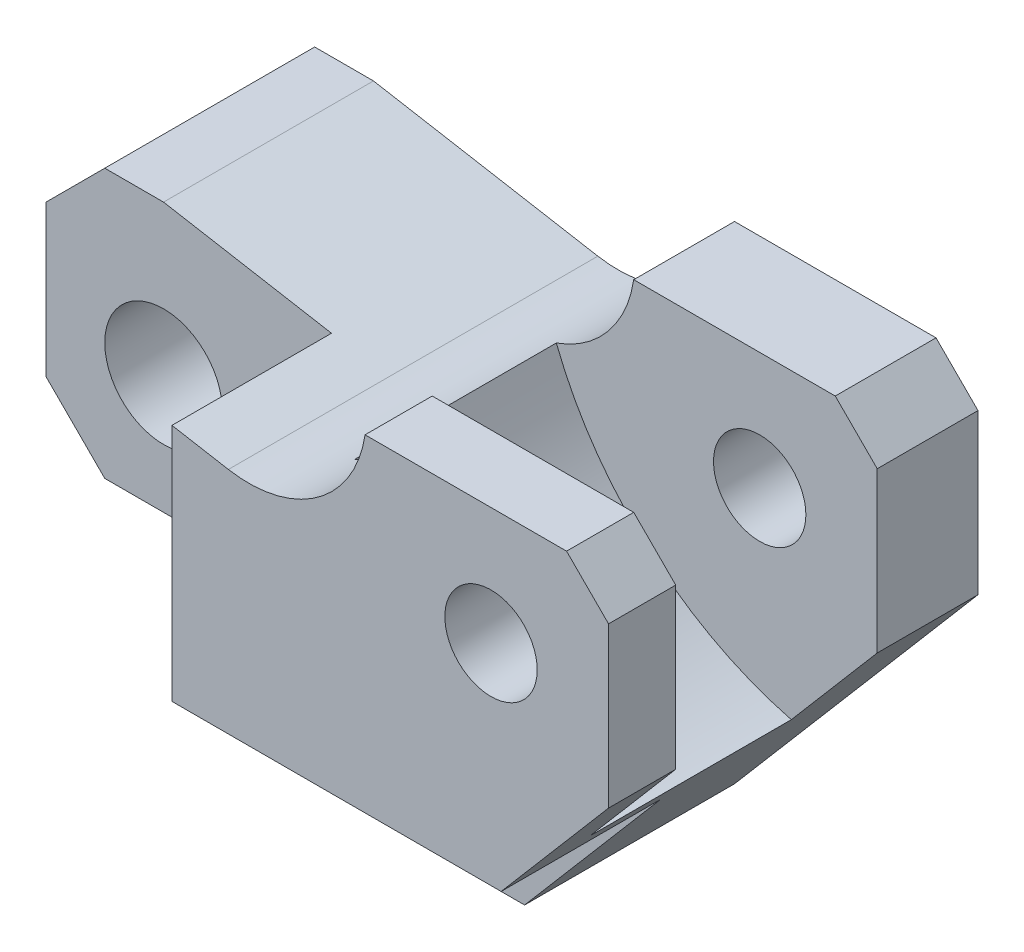
ISO-10303-21;
HEADER;
FILE_DESCRIPTION(('STEP AP214'),'2;1');
FILE_NAME('part.step','',(''),(''),'','','');
FILE_SCHEMA(('AUTOMOTIVE_DESIGN { 1 0 10303 214 1 1 1 1 }'));
ENDSEC;
DATA;
#1=APPLICATION_CONTEXT('core data for automotive mechanical design processes');
#2=APPLICATION_PROTOCOL_DEFINITION('international standard','automotive_design',2000,#1);
#3=PRODUCT_CONTEXT('',#1,'mechanical');
#4=PRODUCT('Part','Part','',(#3));
#5=PRODUCT_RELATED_PRODUCT_CATEGORY('part','',(#4));
#6=PRODUCT_DEFINITION_FORMATION('','',#4);
#7=PRODUCT_DEFINITION_CONTEXT('part definition',#1,'design');
#8=PRODUCT_DEFINITION('design','',#6,#7);
#9=PRODUCT_DEFINITION_SHAPE('','',#8);
#10=(LENGTH_UNIT() NAMED_UNIT(*) SI_UNIT(.MILLI.,.METRE.));
#11=(NAMED_UNIT(*) PLANE_ANGLE_UNIT() SI_UNIT($,.RADIAN.));
#12=(NAMED_UNIT(*) SI_UNIT($,.STERADIAN.) SOLID_ANGLE_UNIT());
#13=UNCERTAINTY_MEASURE_WITH_UNIT(LENGTH_MEASURE(1.E-05),#10,'distance_accuracy_value','');
#14=(GEOMETRIC_REPRESENTATION_CONTEXT(3) GLOBAL_UNCERTAINTY_ASSIGNED_CONTEXT((#13)) GLOBAL_UNIT_ASSIGNED_CONTEXT((#10,
#11,#12)) REPRESENTATION_CONTEXT('',''));
#15=CARTESIAN_POINT('',(0.,0.,0.));
#16=DIRECTION('',(0.,0.,1.));
#17=DIRECTION('',(1.,0.,0.));
#18=AXIS2_PLACEMENT_3D('',#15,#16,#17);
#19=CARTESIAN_POINT('',(-3.11505664168053,2.65696007672751,44.));
#20=DIRECTION('',(0.760833951959086,-0.64894660608275,0.));
#21=DIRECTION('',(0.64894660608275,0.760833951959086,0.));
#22=AXIS2_PLACEMENT_3D('',#19,#20,#21);
#23=PLANE('',#22);
#24=DIRECTION('',(0.,0.,-1.));
#25=VECTOR('',#24,1.);
#26=CARTESIAN_POINT('',(-4.21574320437276,1.36649996874352,36.));
#27=LINE('',#26,#25);
#28=CARTESIAN_POINT('',(-4.21574320437276,1.36649996874352,36.));
#29=VERTEX_POINT('',#28);
#30=CARTESIAN_POINT('',(-4.21574320437276,1.36649996874352,12.));
#31=VERTEX_POINT('',#30);
#32=EDGE_CURVE('E218',#29,#31,#27,.T.);
#33=ORIENTED_EDGE('',*,*,#32,.F.);
#34=DIRECTION('',(-0.64894660608275,-0.760833951959086,0.));
#35=VECTOR('',#34,1.);
#36=CARTESIAN_POINT('',(6.01955091327429,13.3664999687435,36.));
#37=LINE('',#36,#35);
#38=CARTESIAN_POINT('',(6.01955091327429,13.3664999687435,36.));
#39=VERTEX_POINT('',#38);
#40=EDGE_CURVE('E203',#39,#29,#37,.T.);
#41=ORIENTED_EDGE('',*,*,#40,.F.);
#42=DIRECTION('',(0.,0.,-1.));
#43=VECTOR('',#42,1.);
#44=CARTESIAN_POINT('',(6.01955091327429,13.3664999687435,44.));
#45=LINE('',#44,#43);
#46=CARTESIAN_POINT('',(6.01955091327429,13.3664999687435,44.));
#47=VERTEX_POINT('',#46);
#48=EDGE_CURVE('E215',#47,#39,#45,.T.);
#49=ORIENTED_EDGE('',*,*,#48,.F.);
#50=DIRECTION('',(-0.64894660608275,-0.760833951959086,0.));
#51=VECTOR('',#50,1.);
#52=CARTESIAN_POINT('',(-3.11505664168053,2.65696007672751,44.));
#53=LINE('',#52,#51);
#54=CARTESIAN_POINT('',(-6.77456673378454,-1.63350003125649,44.));
#55=VERTEX_POINT('',#54);
#56=EDGE_CURVE('E320',#47,#55,#53,.T.);
#57=ORIENTED_EDGE('',*,*,#56,.T.);
#58=DIRECTION('',(0.,0.,1.));
#59=VECTOR('',#58,1.);
#60=CARTESIAN_POINT('',(-6.77456673378454,-1.63350003125649,25.));
#61=LINE('',#60,#59);
#62=CARTESIAN_POINT('',(-6.77456673378454,-1.63350003125649,25.));
#63=VERTEX_POINT('',#62);
#64=EDGE_CURVE('E273',#63,#55,#61,.T.);
#65=ORIENTED_EDGE('',*,*,#64,.F.);
#66=DIRECTION('',(0.648946606082749,0.760833951959086,0.));
#67=VECTOR('',#66,1.);
#68=CARTESIAN_POINT('',(-6.77456673378454,-1.63350003125649,25.));
#69=LINE('',#68,#67);
#70=CARTESIAN_POINT('',(-22.9804490867257,-20.6335000312565,25.));
#71=VERTEX_POINT('',#70);
#72=EDGE_CURVE('E267',#71,#63,#69,.T.);
#73=ORIENTED_EDGE('',*,*,#72,.F.);
#74=DIRECTION('',(0.,0.,-1.));
#75=VECTOR('',#74,1.);
#76=CARTESIAN_POINT('',(-22.9804490867257,-20.6335000312565,44.));
#77=LINE('',#76,#75);
#78=CARTESIAN_POINT('',(-22.9804490867257,-20.6335000312565,0.));
#79=VERTEX_POINT('',#78);
#80=EDGE_CURVE('E227',#71,#79,#77,.T.);
#81=ORIENTED_EDGE('',*,*,#80,.T.);
#82=DIRECTION('',(-0.64894660608275,-0.760833951959086,0.));
#83=VECTOR('',#82,1.);
#84=CARTESIAN_POINT('',(-3.11505664168053,2.65696007672751,0.));
#85=LINE('',#84,#83);
#86=CARTESIAN_POINT('',(6.01955091327429,13.3664999687435,0.));
#87=VERTEX_POINT('',#86);
#88=EDGE_CURVE('E360',#87,#79,#85,.T.);
#89=ORIENTED_EDGE('',*,*,#88,.F.);
#90=CARTESIAN_POINT('',(6.01955091327429,13.3664999687435,12.));
#91=VERTEX_POINT('',#90);
#92=EDGE_CURVE('E228',#91,#87,#45,.T.);
#93=ORIENTED_EDGE('',*,*,#92,.F.);
#94=DIRECTION('',(-0.64894660608275,-0.760833951959086,0.));
#95=VECTOR('',#94,1.);
#96=CARTESIAN_POINT('',(6.01955091327429,13.3664999687435,12.));
#97=LINE('',#96,#95);
#98=EDGE_CURVE('E464',#91,#31,#97,.T.);
#99=ORIENTED_EDGE('',*,*,#98,.T.);
#100=EDGE_LOOP('',(#33,#41,#49,#57,#65,#73,#81,#89,#93,#99));
#101=FACE_BOUND('',#100,.T.);
#102=ADVANCED_FACE('F41',(#101),#23,.T.);
#103=CARTESIAN_POINT('',(6.01955091327429,0.,44.));
#104=DIRECTION('',(1.,0.,0.));
#105=DIRECTION('',(0.,1.,0.));
#106=AXIS2_PLACEMENT_3D('',#103,#104,#105);
#107=PLANE('',#106);
#108=ORIENTED_EDGE('',*,*,#48,.T.);
#109=DIRECTION('',(0.,-1.,0.));
#110=VECTOR('',#109,1.);
#111=CARTESIAN_POINT('',(6.01955091327428,32.3664999687435,36.));
#112=LINE('',#111,#110);
#113=CARTESIAN_POINT('',(6.01955091327428,32.3664999687435,36.));
#114=VERTEX_POINT('',#113);
#115=EDGE_CURVE('E198',#114,#39,#112,.T.);
#116=ORIENTED_EDGE('',*,*,#115,.F.);
#117=DIRECTION('',(0.,0.,-1.));
#118=VECTOR('',#117,1.);
#119=CARTESIAN_POINT('',(6.01955091327428,32.3664999687435,44.));
#120=LINE('',#119,#118);
#121=CARTESIAN_POINT('',(6.01955091327428,32.3664999687435,44.));
#122=VERTEX_POINT('',#121);
#123=EDGE_CURVE('E233',#122,#114,#120,.T.);
#124=ORIENTED_EDGE('',*,*,#123,.F.);
#125=DIRECTION('',(0.,-1.,0.));
#126=VECTOR('',#125,1.);
#127=CARTESIAN_POINT('',(6.01955091327429,0.,44.));
#128=LINE('',#127,#126);
#129=EDGE_CURVE('E225',#122,#47,#128,.T.);
#130=ORIENTED_EDGE('',*,*,#129,.T.);
#131=EDGE_LOOP('',(#108,#116,#124,#130));
#132=FACE_BOUND('',#131,.T.);
#133=ADVANCED_FACE('F223',(#132),#107,.T.);
#134=CARTESIAN_POINT('',(19.1930254410089,19.1930254410089,44.));
#135=DIRECTION('',(0.707106781186548,0.707106781186548,0.));
#136=DIRECTION('',(-0.707106781186548,0.707106781186548,0.));
#137=AXIS2_PLACEMENT_3D('',#134,#135,#136);
#138=PLANE('',#137);
#139=ORIENTED_EDGE('',*,*,#123,.T.);
#140=DIRECTION('',(0.707106781186547,-0.707106781186548,0.));
#141=VECTOR('',#140,1.);
#142=CARTESIAN_POINT('',(1.01955091327429,37.3664999687435,36.));
#143=LINE('',#142,#141);
#144=CARTESIAN_POINT('',(1.01955091327429,37.3664999687435,36.));
#145=VERTEX_POINT('',#144);
#146=EDGE_CURVE('E206',#145,#114,#143,.T.);
#147=ORIENTED_EDGE('',*,*,#146,.F.);
#148=DIRECTION('',(0.,0.,-1.));
#149=VECTOR('',#148,1.);
#150=CARTESIAN_POINT('',(1.01955091327429,37.3664999687435,44.));
#151=LINE('',#150,#149);
#152=CARTESIAN_POINT('',(1.01955091327429,37.3664999687435,44.));
#153=VERTEX_POINT('',#152);
#154=EDGE_CURVE('E428',#153,#145,#151,.T.);
#155=ORIENTED_EDGE('',*,*,#154,.F.);
#156=DIRECTION('',(0.707106781186548,-0.707106781186548,0.));
#157=VECTOR('',#156,1.);
#158=CARTESIAN_POINT('',(19.1930254410089,19.1930254410089,44.));
#159=LINE('',#158,#157);
#160=EDGE_CURVE('E326',#153,#122,#159,.T.);
#161=ORIENTED_EDGE('',*,*,#160,.T.);
#162=EDGE_LOOP('',(#139,#147,#155,#161));
#163=FACE_BOUND('',#162,.T.);
#164=ADVANCED_FACE('F491',(#163),#138,.T.);
#165=CARTESIAN_POINT('',(0.,37.3664999687435,44.));
#166=DIRECTION('',(0.,1.,0.));
#167=DIRECTION('',(0.,0.,1.));
#168=AXIS2_PLACEMENT_3D('',#165,#166,#167);
#169=PLANE('',#168);
#170=ORIENTED_EDGE('',*,*,#154,.T.);
#171=DIRECTION('',(1.,0.,0.));
#172=VECTOR('',#171,1.);
#173=CARTESIAN_POINT('',(-22.9804490867257,37.3664999687435,36.));
#174=LINE('',#173,#172);
#175=CARTESIAN_POINT('',(-22.9804490867257,37.3664999687435,36.));
#176=VERTEX_POINT('',#175);
#177=EDGE_CURVE('E475',#176,#145,#174,.T.);
#178=ORIENTED_EDGE('',*,*,#177,.F.);
#179=DIRECTION('',(0.,0.,-1.));
#180=VECTOR('',#179,1.);
#181=CARTESIAN_POINT('',(-22.9804490867257,37.3664999687435,44.));
#182=LINE('',#181,#180);
#183=CARTESIAN_POINT('',(-22.9804490867257,37.3664999687435,44.));
#184=VERTEX_POINT('',#183);
#185=EDGE_CURVE('E424',#184,#176,#182,.T.);
#186=ORIENTED_EDGE('',*,*,#185,.F.);
#187=DIRECTION('',(1.,0.,0.));
#188=VECTOR('',#187,1.);
#189=CARTESIAN_POINT('',(0.,37.3664999687435,44.));
#190=LINE('',#189,#188);
#191=EDGE_CURVE('E330',#184,#153,#190,.T.);
#192=ORIENTED_EDGE('',*,*,#191,.T.);
#193=EDGE_LOOP('',(#170,#178,#186,#192));
#194=FACE_BOUND('',#193,.T.);
#195=ADVANCED_FACE('F484',(#194),#169,.T.);
#196=CARTESIAN_POINT('',(-36.8257899574065,39.4417195172866,44.));
#197=DIRECTION('',(0.,0.,-1.));
#198=DIRECTION('',(-1.,0.,0.));
#199=AXIS2_PLACEMENT_3D('',#196,#197,#198);
#200=CYLINDRICAL_SURFACE('',#199,14.);
#201=ORIENTED_EDGE('',*,*,#185,.T.);
#202=CARTESIAN_POINT('',(-36.8257899574065,39.4417195172866,36.));
#203=DIRECTION('',(0.,0.,1.));
#204=DIRECTION('',(-1.,0.,0.));
#205=AXIS2_PLACEMENT_3D('',#202,#203,#204);
#206=CIRCLE('',#205,14.);
#207=CARTESIAN_POINT('',(-32.2003409016786,26.227892629028,36.));
#208=VERTEX_POINT('',#207);
#209=EDGE_CURVE('E478',#208,#176,#206,.T.);
#210=ORIENTED_EDGE('',*,*,#209,.F.);
#211=DIRECTION('',(0.,0.,-1.));
#212=VECTOR('',#211,1.);
#213=CARTESIAN_POINT('',(-32.2003409016786,26.227892629028,36.));
#214=LINE('',#213,#212);
#215=CARTESIAN_POINT('',(-32.2003409016786,26.227892629028,12.));
#216=VERTEX_POINT('',#215);
#217=EDGE_CURVE('E241',#208,#216,#214,.T.);
#218=ORIENTED_EDGE('',*,*,#217,.T.);
#219=CARTESIAN_POINT('',(-36.8257899574065,39.4417195172866,12.));
#220=DIRECTION('',(0.,0.,1.));
#221=DIRECTION('',(-1.,0.,0.));
#222=AXIS2_PLACEMENT_3D('',#219,#220,#221);
#223=CIRCLE('',#222,14.);
#224=CARTESIAN_POINT('',(-22.9804490867257,37.3664999687435,12.));
#225=VERTEX_POINT('',#224);
#226=EDGE_CURVE('E455',#216,#225,#223,.T.);
#227=ORIENTED_EDGE('',*,*,#226,.T.);
#228=CARTESIAN_POINT('',(-22.9804490867257,37.3664999687435,0.));
#229=VERTEX_POINT('',#228);
#230=EDGE_CURVE('E423',#225,#229,#182,.T.);
#231=ORIENTED_EDGE('',*,*,#230,.T.);
#232=CARTESIAN_POINT('',(-36.8257899574065,39.4417195172866,0.));
#233=DIRECTION('',(0.,0.,1.));
#234=DIRECTION('',(1.,0.,0.));
#235=AXIS2_PLACEMENT_3D('',#232,#233,#234);
#236=CIRCLE('',#235,14.);
#237=CARTESIAN_POINT('',(-39.2568644447436,25.6544109751157,0.));
#238=VERTEX_POINT('',#237);
#239=EDGE_CURVE('E376',#238,#229,#236,.T.);
#240=ORIENTED_EDGE('',*,*,#239,.F.);
#241=DIRECTION('',(0.,0.,-1.));
#242=VECTOR('',#241,1.);
#243=CARTESIAN_POINT('',(-39.2568644447436,25.6544109751157,44.));
#244=LINE('',#243,#242);
#245=CARTESIAN_POINT('',(-39.2568644447436,25.6544109751157,44.));
#246=VERTEX_POINT('',#245);
#247=EDGE_CURVE('E420',#246,#238,#244,.T.);
#248=ORIENTED_EDGE('',*,*,#247,.F.);
#249=CARTESIAN_POINT('',(-36.8257899574065,39.4417195172866,44.));
#250=DIRECTION('',(0.,0.,1.));
#251=DIRECTION('',(1.,0.,0.));
#252=AXIS2_PLACEMENT_3D('',#249,#250,#251);
#253=CIRCLE('',#252,14.);
#254=EDGE_CURVE('E334',#246,#184,#253,.T.);
#255=ORIENTED_EDGE('',*,*,#254,.T.);
#256=EDGE_LOOP('',(#201,#210,#218,#227,#231,#240,#248,#255));
#257=FACE_BOUND('',#256,.T.);
#258=ADVANCED_FACE('F453',(#257),#200,.F.);
#259=CARTESIAN_POINT('',(-7.98044908672572,23.3664999687435,0.));
#260=DIRECTION('',(0.,0.,1.));
#261=DIRECTION('',(1.,0.,0.));
#262=AXIS2_PLACEMENT_3D('',#259,#260,#261);
#263=CYLINDRICAL_SURFACE('',#262,5.5);
#264=CARTESIAN_POINT('',(-7.98044908672572,23.3664999687435,44.));
#265=DIRECTION('',(0.,0.,1.));
#266=DIRECTION('',(1.,0.,0.));
#267=AXIS2_PLACEMENT_3D('',#264,#265,#266);
#268=CIRCLE('',#267,5.5);
#269=CARTESIAN_POINT('',(-2.48044908672572,23.3664999687435,44.));
#270=VERTEX_POINT('',#269);
#271=EDGE_CURVE('E311',#270,#270,#268,.T.);
#272=ORIENTED_EDGE('',*,*,#271,.T.);
#273=EDGE_LOOP('',(#272));
#274=FACE_BOUND('',#273,.T.);
#275=CARTESIAN_POINT('',(-7.98044908672572,23.3664999687435,36.));
#276=DIRECTION('',(0.,0.,-1.));
#277=DIRECTION('',(-1.,0.,0.));
#278=AXIS2_PLACEMENT_3D('',#275,#276,#277);
#279=CIRCLE('',#278,5.5);
#280=CARTESIAN_POINT('',(-13.4804490867257,23.3664999687435,36.));
#281=VERTEX_POINT('',#280);
#282=EDGE_CURVE('E45',#281,#281,#279,.F.);
#283=ORIENTED_EDGE('',*,*,#282,.F.);
#284=EDGE_LOOP('',(#283));
#285=FACE_BOUND('',#284,.T.);
#286=ADVANCED_FACE('F517',(#274,#285),#263,.F.);
#287=CARTESIAN_POINT('',(-40.404910175385,-6.63350003125649,44.));
#288=DIRECTION('',(0.,0.,-1.));
#289=DIRECTION('',(-1.,0.,0.));
#290=AXIS2_PLACEMENT_3D('',#287,#288,#289);
#291=CYLINDRICAL_SURFACE('',#290,5.);
#292=CARTESIAN_POINT('',(-40.404910175385,-6.63350003125649,25.));
#293=DIRECTION('',(0.,0.,-1.));
#294=DIRECTION('',(1.,0.,0.));
#295=AXIS2_PLACEMENT_3D('',#292,#293,#294);
#296=CIRCLE('',#295,5.);
#297=CARTESIAN_POINT('',(-40.404910175385,-1.63350003125649,25.));
#298=VERTEX_POINT('',#297);
#299=CARTESIAN_POINT('',(-35.4592714339732,-5.89820591360942,25.));
#300=VERTEX_POINT('',#299);
#301=EDGE_CURVE('E257',#298,#300,#296,.T.);
#302=ORIENTED_EDGE('',*,*,#301,.F.);
#303=DIRECTION('',(0.,0.,-1.));
#304=VECTOR('',#303,1.);
#305=CARTESIAN_POINT('',(-40.404910175385,-1.63350003125649,44.));
#306=LINE('',#305,#304);
#307=CARTESIAN_POINT('',(-40.404910175385,-1.63350003125649,0.));
#308=VERTEX_POINT('',#307);
#309=EDGE_CURVE('E344',#298,#308,#306,.T.);
#310=ORIENTED_EDGE('',*,*,#309,.T.);
#311=CARTESIAN_POINT('',(-40.404910175385,-6.63350003125649,0.));
#312=DIRECTION('',(0.,0.,1.));
#313=DIRECTION('',(1.,0.,0.));
#314=AXIS2_PLACEMENT_3D('',#311,#312,#313);
#315=CIRCLE('',#314,5.);
#316=CARTESIAN_POINT('',(-35.4592714339732,-5.89820591360943,0.));
#317=VERTEX_POINT('',#316);
#318=EDGE_CURVE('E348',#308,#317,#315,.F.);
#319=ORIENTED_EDGE('',*,*,#318,.T.);
#320=DIRECTION('',(0.,0.,-1.));
#321=VECTOR('',#320,1.);
#322=CARTESIAN_POINT('',(-35.4592714339732,-5.89820591360943,44.));
#323=LINE('',#322,#321);
#324=EDGE_CURVE('E11',#300,#317,#323,.T.);
#325=ORIENTED_EDGE('',*,*,#324,.F.);
#326=EDGE_LOOP('',(#302,#310,#319,#325));
#327=FACE_BOUND('',#326,.T.);
#328=ADVANCED_FACE('F514',(#327),#291,.F.);
#329=CARTESIAN_POINT('',(-6.77456673378454,-1.63350003125649,44.));
#330=DIRECTION('',(0.,0.,-1.));
#331=DIRECTION('',(-1.,0.,0.));
#332=AXIS2_PLACEMENT_3D('',#329,#330,#331);
#333=CYLINDRICAL_SURFACE('',#332,29.);
#334=CARTESIAN_POINT('',(-6.77456673378454,-1.63350003125649,25.));
#335=DIRECTION('',(0.,0.,1.));
#336=DIRECTION('',(1.,0.,0.));
#337=AXIS2_PLACEMENT_3D('',#334,#335,#336);
#338=CIRCLE('',#337,29.);
#339=CARTESIAN_POINT('',(-28.6834690339912,-20.6335000312565,25.));
#340=VERTEX_POINT('',#339);
#341=EDGE_CURVE('E260',#300,#340,#338,.T.);
#342=ORIENTED_EDGE('',*,*,#341,.F.);
#343=ORIENTED_EDGE('',*,*,#324,.T.);
#344=CARTESIAN_POINT('',(-6.77456673378454,-1.63350003125649,0.));
#345=DIRECTION('',(0.,0.,1.));
#346=DIRECTION('',(1.,0.,0.));
#347=AXIS2_PLACEMENT_3D('',#344,#345,#346);
#348=CIRCLE('',#347,29.);
#349=CARTESIAN_POINT('',(-28.6834690339912,-20.6335000312565,0.));
#350=VERTEX_POINT('',#349);
#351=EDGE_CURVE('E352',#317,#350,#348,.T.);
#352=ORIENTED_EDGE('',*,*,#351,.T.);
#353=DIRECTION('',(0.,0.,-1.));
#354=VECTOR('',#353,1.);
#355=CARTESIAN_POINT('',(-28.6834690339912,-20.6335000312565,44.));
#356=LINE('',#355,#354);
#357=EDGE_CURVE('E51',#340,#350,#356,.T.);
#358=ORIENTED_EDGE('',*,*,#357,.F.);
#359=EDGE_LOOP('',(#342,#343,#352,#358));
#360=FACE_BOUND('',#359,.T.);
#361=ADVANCED_FACE('F511',(#360),#333,.T.);
#362=CARTESIAN_POINT('',(0.,-20.6335000312565,44.));
#363=DIRECTION('',(0.,1.,0.));
#364=DIRECTION('',(-1.,0.,0.));
#365=AXIS2_PLACEMENT_3D('',#362,#363,#364);
#366=PLANE('',#365);
#367=DIRECTION('',(1.,0.,0.));
#368=VECTOR('',#367,1.);
#369=CARTESIAN_POINT('',(-28.6834690339912,-20.6335000312565,25.));
#370=LINE('',#369,#368);
#371=EDGE_CURVE('E264',#340,#71,#370,.T.);
#372=ORIENTED_EDGE('',*,*,#371,.F.);
#373=ORIENTED_EDGE('',*,*,#357,.T.);
#374=DIRECTION('',(1.,0.,0.));
#375=VECTOR('',#374,1.);
#376=CARTESIAN_POINT('',(0.,-20.6335000312565,0.));
#377=LINE('',#376,#375);
#378=EDGE_CURVE('E356',#350,#79,#377,.T.);
#379=ORIENTED_EDGE('',*,*,#378,.T.);
#380=ORIENTED_EDGE('',*,*,#80,.F.);
#381=EDGE_LOOP('',(#372,#373,#379,#380));
#382=FACE_BOUND('',#381,.T.);
#383=ADVANCED_FACE('F508',(#382),#366,.F.);
#384=DIRECTION('',(0.,-1.,0.));
#385=VECTOR('',#384,1.);
#386=CARTESIAN_POINT('',(6.01955091327428,32.3664999687435,12.));
#387=LINE('',#386,#385);
#388=CARTESIAN_POINT('',(6.01955091327428,32.3664999687435,12.));
#389=VERTEX_POINT('',#388);
#390=EDGE_CURVE('E469',#389,#91,#387,.T.);
#391=ORIENTED_EDGE('',*,*,#390,.T.);
#392=ORIENTED_EDGE('',*,*,#92,.T.);
#393=DIRECTION('',(0.,-1.,0.));
#394=VECTOR('',#393,1.);
#395=CARTESIAN_POINT('',(6.01955091327429,0.,0.));
#396=LINE('',#395,#394);
#397=CARTESIAN_POINT('',(6.01955091327428,32.3664999687435,0.));
#398=VERTEX_POINT('',#397);
#399=EDGE_CURVE('E364',#398,#87,#396,.T.);
#400=ORIENTED_EDGE('',*,*,#399,.F.);
#401=EDGE_CURVE('E431',#389,#398,#120,.T.);
#402=ORIENTED_EDGE('',*,*,#401,.F.);
#403=EDGE_LOOP('',(#391,#392,#400,#402));
#404=FACE_BOUND('',#403,.T.);
#405=ADVANCED_FACE('F501',(#404),#107,.T.);
#406=DIRECTION('',(0.707106781186547,-0.707106781186548,0.));
#407=VECTOR('',#406,1.);
#408=CARTESIAN_POINT('',(1.01955091327429,37.3664999687435,12.));
#409=LINE('',#408,#407);
#410=CARTESIAN_POINT('',(1.01955091327429,37.3664999687435,12.));
#411=VERTEX_POINT('',#410);
#412=EDGE_CURVE('E211',#411,#389,#409,.T.);
#413=ORIENTED_EDGE('',*,*,#412,.T.);
#414=ORIENTED_EDGE('',*,*,#401,.T.);
#415=DIRECTION('',(0.707106781186548,-0.707106781186548,0.));
#416=VECTOR('',#415,1.);
#417=CARTESIAN_POINT('',(19.1930254410089,19.1930254410089,0.));
#418=LINE('',#417,#416);
#419=CARTESIAN_POINT('',(1.01955091327429,37.3664999687435,0.));
#420=VERTEX_POINT('',#419);
#421=EDGE_CURVE('E368',#420,#398,#418,.T.);
#422=ORIENTED_EDGE('',*,*,#421,.F.);
#423=EDGE_CURVE('E427',#411,#420,#151,.T.);
#424=ORIENTED_EDGE('',*,*,#423,.F.);
#425=EDGE_LOOP('',(#413,#414,#422,#424));
#426=FACE_BOUND('',#425,.T.);
#427=ADVANCED_FACE('F444',(#426),#138,.T.);
#428=DIRECTION('',(1.,0.,0.));
#429=VECTOR('',#428,1.);
#430=CARTESIAN_POINT('',(-22.9804490867257,37.3664999687435,12.));
#431=LINE('',#430,#429);
#432=EDGE_CURVE('E59',#225,#411,#431,.T.);
#433=ORIENTED_EDGE('',*,*,#432,.T.);
#434=ORIENTED_EDGE('',*,*,#423,.T.);
#435=DIRECTION('',(1.,0.,0.));
#436=VECTOR('',#435,1.);
#437=CARTESIAN_POINT('',(0.,37.3664999687435,0.));
#438=LINE('',#437,#436);
#439=EDGE_CURVE('E372',#229,#420,#438,.T.);
#440=ORIENTED_EDGE('',*,*,#439,.F.);
#441=ORIENTED_EDGE('',*,*,#230,.F.);
#442=EDGE_LOOP('',(#433,#434,#440,#441));
#443=FACE_BOUND('',#442,.T.);
#444=ADVANCED_FACE('F440',(#443),#169,.T.);
#445=CARTESIAN_POINT('',(3.20342335390967,18.1675166275667,44.));
#446=DIRECTION('',(0.173648177666931,0.984807753012208,0.));
#447=DIRECTION('',(-0.984807753012208,0.173648177666931,0.));
#448=AXIS2_PLACEMENT_3D('',#445,#446,#447);
#449=PLANE('',#448);
#450=DIRECTION('',(0.,0.,1.));
#451=VECTOR('',#450,1.);
#452=CARTESIAN_POINT('',(-45.9804490867257,26.8399603545742,25.));
#453=LINE('',#452,#451);
#454=CARTESIAN_POINT('',(-45.9804490867257,26.8399603545742,25.));
#455=VERTEX_POINT('',#454);
#456=CARTESIAN_POINT('',(-45.9804490867257,26.8399603545742,44.));
#457=VERTEX_POINT('',#456);
#458=EDGE_CURVE('E261',#455,#457,#453,.T.);
#459=ORIENTED_EDGE('',*,*,#458,.T.);
#460=DIRECTION('',(0.984807753012208,-0.173648177666931,0.));
#461=VECTOR('',#460,1.);
#462=CARTESIAN_POINT('',(3.20342335390967,18.1675166275667,44.));
#463=LINE('',#462,#461);
#464=EDGE_CURVE('E338',#457,#246,#463,.T.);
#465=ORIENTED_EDGE('',*,*,#464,.T.);
#466=ORIENTED_EDGE('',*,*,#247,.T.);
#467=DIRECTION('',(0.984807753012208,-0.173648177666931,0.));
#468=VECTOR('',#467,1.);
#469=CARTESIAN_POINT('',(3.20342335390967,18.1675166275667,0.));
#470=LINE('',#469,#468);
#471=CARTESIAN_POINT('',(-65.9804490867257,30.3664999687435,0.));
#472=VERTEX_POINT('',#471);
#473=EDGE_CURVE('E380',#472,#238,#470,.T.);
#474=ORIENTED_EDGE('',*,*,#473,.F.);
#475=DIRECTION('',(0.,0.,-1.));
#476=VECTOR('',#475,1.);
#477=CARTESIAN_POINT('',(-65.9804490867257,30.3664999687435,44.));
#478=LINE('',#477,#476);
#479=CARTESIAN_POINT('',(-65.9804490867257,30.3664999687435,25.));
#480=VERTEX_POINT('',#479);
#481=EDGE_CURVE('E417',#480,#472,#478,.T.);
#482=ORIENTED_EDGE('',*,*,#481,.F.);
#483=DIRECTION('',(-0.984807753012208,0.173648177666931,0.));
#484=VECTOR('',#483,1.);
#485=CARTESIAN_POINT('',(-65.9804490867257,30.3664999687435,25.));
#486=LINE('',#485,#484);
#487=EDGE_CURVE('E286',#455,#480,#486,.T.);
#488=ORIENTED_EDGE('',*,*,#487,.F.);
#489=EDGE_LOOP('',(#459,#465,#466,#474,#482,#488));
#490=FACE_BOUND('',#489,.T.);
#491=ADVANCED_FACE('F551',(#490),#449,.T.);
#492=CARTESIAN_POINT('',(0.,30.3664999687435,44.));
#493=DIRECTION('',(0.,1.,0.));
#494=DIRECTION('',(0.,0.,1.));
#495=AXIS2_PLACEMENT_3D('',#492,#493,#494);
#496=PLANE('',#495);
#497=DIRECTION('',(-1.,0.,0.));
#498=VECTOR('',#497,1.);
#499=CARTESIAN_POINT('',(-72.9804490867257,30.3664999687435,25.));
#500=LINE('',#499,#498);
#501=CARTESIAN_POINT('',(-72.9804490867257,30.3664999687435,25.));
#502=VERTEX_POINT('',#501);
#503=EDGE_CURVE('E289',#480,#502,#500,.T.);
#504=ORIENTED_EDGE('',*,*,#503,.F.);
#505=ORIENTED_EDGE('',*,*,#481,.T.);
#506=DIRECTION('',(1.,0.,0.));
#507=VECTOR('',#506,1.);
#508=CARTESIAN_POINT('',(0.,30.3664999687435,0.));
#509=LINE('',#508,#507);
#510=CARTESIAN_POINT('',(-72.9804490867257,30.3664999687435,0.));
#511=VERTEX_POINT('',#510);
#512=EDGE_CURVE('E384',#511,#472,#509,.T.);
#513=ORIENTED_EDGE('',*,*,#512,.F.);
#514=DIRECTION('',(0.,0.,-1.));
#515=VECTOR('',#514,1.);
#516=CARTESIAN_POINT('',(-72.9804490867257,30.3664999687435,44.));
#517=LINE('',#516,#515);
#518=EDGE_CURVE('E414',#502,#511,#517,.T.);
#519=ORIENTED_EDGE('',*,*,#518,.F.);
#520=EDGE_LOOP('',(#504,#505,#513,#519));
#521=FACE_BOUND('',#520,.T.);
#522=ADVANCED_FACE('F559',(#521),#496,.T.);
#523=CARTESIAN_POINT('',(-51.6734745277346,51.6734745277346,44.));
#524=DIRECTION('',(0.707106781186548,-0.707106781186547,0.));
#525=DIRECTION('',(0.707106781186547,0.707106781186548,0.));
#526=AXIS2_PLACEMENT_3D('',#523,#524,#525);
#527=PLANE('',#526);
#528=DIRECTION('',(0.,0.,-1.));
#529=VECTOR('',#528,1.);
#530=CARTESIAN_POINT('',(-79.9804490867257,23.3664999687435,44.));
#531=LINE('',#530,#529);
#532=CARTESIAN_POINT('',(-79.9804490867257,23.3664999687435,25.));
#533=VERTEX_POINT('',#532);
#534=CARTESIAN_POINT('',(-79.9804490867257,23.3664999687435,0.));
#535=VERTEX_POINT('',#534);
#536=EDGE_CURVE('E411',#533,#535,#531,.T.);
#537=ORIENTED_EDGE('',*,*,#536,.F.);
#538=DIRECTION('',(-0.707106781186547,-0.707106781186548,0.));
#539=VECTOR('',#538,1.);
#540=CARTESIAN_POINT('',(-72.9804490867257,30.3664999687435,25.));
#541=LINE('',#540,#539);
#542=EDGE_CURVE('E292',#502,#533,#541,.T.);
#543=ORIENTED_EDGE('',*,*,#542,.F.);
#544=ORIENTED_EDGE('',*,*,#518,.T.);
#545=DIRECTION('',(-0.707106781186547,-0.707106781186548,0.));
#546=VECTOR('',#545,1.);
#547=CARTESIAN_POINT('',(-51.6734745277346,51.6734745277346,0.));
#548=LINE('',#547,#546);
#549=EDGE_CURVE('E388',#511,#535,#548,.T.);
#550=ORIENTED_EDGE('',*,*,#549,.T.);
#551=EDGE_LOOP('',(#537,#543,#544,#550));
#552=FACE_BOUND('',#551,.T.);
#553=ADVANCED_FACE('F564',(#552),#527,.F.);
#554=CARTESIAN_POINT('',(-79.9804490867257,0.,44.));
#555=DIRECTION('',(1.,0.,0.));
#556=DIRECTION('',(0.,1.,0.));
#557=AXIS2_PLACEMENT_3D('',#554,#555,#556);
#558=PLANE('',#557);
#559=DIRECTION('',(0.,0.,-1.));
#560=VECTOR('',#559,1.);
#561=CARTESIAN_POINT('',(-79.9804490867257,5.36649996874351,44.));
#562=LINE('',#561,#560);
#563=CARTESIAN_POINT('',(-79.9804490867257,5.36649996874351,25.));
#564=VERTEX_POINT('',#563);
#565=CARTESIAN_POINT('',(-79.9804490867257,5.36649996874351,0.));
#566=VERTEX_POINT('',#565);
#567=EDGE_CURVE('E408',#564,#566,#562,.T.);
#568=ORIENTED_EDGE('',*,*,#567,.F.);
#569=DIRECTION('',(0.,-1.,0.));
#570=VECTOR('',#569,1.);
#571=CARTESIAN_POINT('',(-79.9804490867257,23.3664999687435,25.));
#572=LINE('',#571,#570);
#573=EDGE_CURVE('E295',#533,#564,#572,.T.);
#574=ORIENTED_EDGE('',*,*,#573,.F.);
#575=ORIENTED_EDGE('',*,*,#536,.T.);
#576=DIRECTION('',(0.,-1.,0.));
#577=VECTOR('',#576,1.);
#578=CARTESIAN_POINT('',(-79.9804490867257,0.,0.));
#579=LINE('',#578,#577);
#580=EDGE_CURVE('E392',#535,#566,#579,.T.);
#581=ORIENTED_EDGE('',*,*,#580,.T.);
#582=EDGE_LOOP('',(#568,#574,#575,#581));
#583=FACE_BOUND('',#582,.T.);
#584=ADVANCED_FACE('F568',(#583),#558,.F.);
#585=CARTESIAN_POINT('',(-37.306974558991,-37.3069745589911,44.));
#586=DIRECTION('',(0.707106781186546,0.707106781186549,0.));
#587=DIRECTION('',(-0.707106781186549,0.707106781186546,0.));
#588=AXIS2_PLACEMENT_3D('',#585,#586,#587);
#589=PLANE('',#588);
#590=DIRECTION('',(0.,0.,-1.));
#591=VECTOR('',#590,1.);
#592=CARTESIAN_POINT('',(-72.9804490867257,-1.63350003125649,44.));
#593=LINE('',#592,#591);
#594=CARTESIAN_POINT('',(-72.9804490867257,-1.63350003125649,25.));
#595=VERTEX_POINT('',#594);
#596=CARTESIAN_POINT('',(-72.9804490867257,-1.63350003125649,0.));
#597=VERTEX_POINT('',#596);
#598=EDGE_CURVE('E405',#595,#597,#593,.T.);
#599=ORIENTED_EDGE('',*,*,#598,.F.);
#600=DIRECTION('',(0.707106781186548,-0.707106781186546,0.));
#601=VECTOR('',#600,1.);
#602=CARTESIAN_POINT('',(-79.9804490867257,5.36649996874351,25.));
#603=LINE('',#602,#601);
#604=EDGE_CURVE('E298',#564,#595,#603,.T.);
#605=ORIENTED_EDGE('',*,*,#604,.F.);
#606=ORIENTED_EDGE('',*,*,#567,.T.);
#607=DIRECTION('',(0.707106781186549,-0.707106781186547,0.));
#608=VECTOR('',#607,1.);
#609=CARTESIAN_POINT('',(-37.306974558991,-37.3069745589911,0.));
#610=LINE('',#609,#608);
#611=EDGE_CURVE('E396',#566,#597,#610,.T.);
#612=ORIENTED_EDGE('',*,*,#611,.T.);
#613=EDGE_LOOP('',(#599,#605,#606,#612));
#614=FACE_BOUND('',#613,.T.);
#615=ADVANCED_FACE('F572',(#614),#589,.F.);
#616=CARTESIAN_POINT('',(-65.9804490867257,12.3664999687435,44.));
#617=DIRECTION('',(0.,0.,-1.));
#618=DIRECTION('',(-1.,0.,0.));
#619=AXIS2_PLACEMENT_3D('',#616,#617,#618);
#620=CYLINDRICAL_SURFACE('',#619,7.);
#621=CARTESIAN_POINT('',(-65.9804490867257,12.3664999687435,25.));
#622=DIRECTION('',(0.,0.,-1.));
#623=DIRECTION('',(-1.,0.,0.));
#624=AXIS2_PLACEMENT_3D('',#621,#622,#623);
#625=CIRCLE('',#624,7.);
#626=CARTESIAN_POINT('',(-72.9804490867257,12.3664999687435,25.));
#627=VERTEX_POINT('',#626);
#628=EDGE_CURVE('E277',#627,#627,#625,.T.);
#629=ORIENTED_EDGE('',*,*,#628,.F.);
#630=EDGE_LOOP('',(#629));
#631=FACE_BOUND('',#630,.T.);
#632=CARTESIAN_POINT('',(-65.9804490867257,12.3664999687435,0.));
#633=DIRECTION('',(0.,0.,1.));
#634=DIRECTION('',(1.,0.,0.));
#635=AXIS2_PLACEMENT_3D('',#632,#633,#634);
#636=CIRCLE('',#635,7.);
#637=CARTESIAN_POINT('',(-58.9804490867257,12.3664999687435,0.));
#638=VERTEX_POINT('',#637);
#639=EDGE_CURVE('E316',#638,#638,#636,.T.);
#640=ORIENTED_EDGE('',*,*,#639,.F.);
#641=EDGE_LOOP('',(#640));
#642=FACE_BOUND('',#641,.T.);
#643=ADVANCED_FACE('F43',(#631,#642),#620,.F.);
#644=CARTESIAN_POINT('',(0.,-1.63350003125649,44.));
#645=DIRECTION('',(0.,1.,0.));
#646=DIRECTION('',(0.,0.,1.));
#647=AXIS2_PLACEMENT_3D('',#644,#645,#646);
#648=PLANE('',#647);
#649=DIRECTION('',(1.,0.,0.));
#650=VECTOR('',#649,1.);
#651=CARTESIAN_POINT('',(0.,-1.63350003125649,44.));
#652=LINE('',#651,#650);
#653=CARTESIAN_POINT('',(-45.9804490867257,-1.63350003125649,44.));
#654=VERTEX_POINT('',#653);
#655=EDGE_CURVE('E341',#654,#55,#652,.T.);
#656=ORIENTED_EDGE('',*,*,#655,.F.);
#657=DIRECTION('',(0.,0.,1.));
#658=VECTOR('',#657,1.);
#659=CARTESIAN_POINT('',(-45.9804490867257,-1.63350003125649,25.));
#660=LINE('',#659,#658);
#661=CARTESIAN_POINT('',(-45.9804490867257,-1.63350003125649,25.));
#662=VERTEX_POINT('',#661);
#663=EDGE_CURVE('E67',#662,#654,#660,.T.);
#664=ORIENTED_EDGE('',*,*,#663,.F.);
#665=DIRECTION('',(1.,0.,0.));
#666=VECTOR('',#665,1.);
#667=CARTESIAN_POINT('',(-72.9804490867257,-1.63350003125649,25.));
#668=LINE('',#667,#666);
#669=EDGE_CURVE('E278',#595,#662,#668,.T.);
#670=ORIENTED_EDGE('',*,*,#669,.F.);
#671=ORIENTED_EDGE('',*,*,#598,.T.);
#672=DIRECTION('',(1.,0.,0.));
#673=VECTOR('',#672,1.);
#674=CARTESIAN_POINT('',(0.,-1.63350003125649,0.));
#675=LINE('',#674,#673);
#676=EDGE_CURVE('E323',#597,#308,#675,.T.);
#677=ORIENTED_EDGE('',*,*,#676,.T.);
#678=ORIENTED_EDGE('',*,*,#309,.F.);
#679=DIRECTION('',(-1.,0.,0.));
#680=VECTOR('',#679,1.);
#681=CARTESIAN_POINT('',(-40.404910175385,-1.63350003125649,25.));
#682=LINE('',#681,#680);
#683=EDGE_CURVE('E270',#63,#298,#682,.T.);
#684=ORIENTED_EDGE('',*,*,#683,.F.);
#685=ORIENTED_EDGE('',*,*,#64,.T.);
#686=EDGE_LOOP('',(#656,#664,#670,#671,#677,#678,#684,#685));
#687=FACE_BOUND('',#686,.T.);
#688=ADVANCED_FACE('F533',(#687),#648,.F.);
#689=CARTESIAN_POINT('',(0.,0.,44.));
#690=DIRECTION('',(0.,0.,1.));
#691=DIRECTION('',(1.,0.,0.));
#692=AXIS2_PLACEMENT_3D('',#689,#690,#691);
#693=PLANE('',#692);
#694=ORIENTED_EDGE('',*,*,#655,.T.);
#695=ORIENTED_EDGE('',*,*,#56,.F.);
#696=ORIENTED_EDGE('',*,*,#129,.F.);
#697=ORIENTED_EDGE('',*,*,#160,.F.);
#698=ORIENTED_EDGE('',*,*,#191,.F.);
#699=ORIENTED_EDGE('',*,*,#254,.F.);
#700=ORIENTED_EDGE('',*,*,#464,.F.);
#701=DIRECTION('',(0.,1.,0.));
#702=VECTOR('',#701,1.);
#703=CARTESIAN_POINT('',(-45.9804490867257,26.8399603545742,44.));
#704=LINE('',#703,#702);
#705=EDGE_CURVE('E247',#654,#457,#704,.T.);
#706=ORIENTED_EDGE('',*,*,#705,.F.);
#707=EDGE_LOOP('',(#694,#695,#696,#697,#698,#699,#700,#706));
#708=FACE_BOUND('',#707,.T.);
#709=ORIENTED_EDGE('',*,*,#271,.F.);
#710=EDGE_LOOP('',(#709));
#711=FACE_BOUND('',#710,.T.);
#712=ADVANCED_FACE('F487',(#708,#711),#693,.T.);
#713=CARTESIAN_POINT('',(0.,0.,0.));
#714=DIRECTION('',(0.,0.,1.));
#715=DIRECTION('',(1.,0.,0.));
#716=AXIS2_PLACEMENT_3D('',#713,#714,#715);
#717=PLANE('',#716);
#718=CARTESIAN_POINT('',(-7.98044908672572,23.3664999687435,0.));
#719=DIRECTION('',(0.,0.,1.));
#720=DIRECTION('',(1.,0.,0.));
#721=AXIS2_PLACEMENT_3D('',#718,#719,#720);
#722=CIRCLE('',#721,5.5);
#723=CARTESIAN_POINT('',(-2.48044908672572,23.3664999687435,0.));
#724=VERTEX_POINT('',#723);
#725=EDGE_CURVE('E312',#724,#724,#722,.T.);
#726=ORIENTED_EDGE('',*,*,#725,.T.);
#727=EDGE_LOOP('',(#726));
#728=FACE_BOUND('',#727,.T.);
#729=ORIENTED_EDGE('',*,*,#639,.T.);
#730=EDGE_LOOP('',(#729));
#731=FACE_BOUND('',#730,.T.);
#732=ORIENTED_EDGE('',*,*,#318,.F.);
#733=ORIENTED_EDGE('',*,*,#676,.F.);
#734=ORIENTED_EDGE('',*,*,#611,.F.);
#735=ORIENTED_EDGE('',*,*,#580,.F.);
#736=ORIENTED_EDGE('',*,*,#549,.F.);
#737=ORIENTED_EDGE('',*,*,#512,.T.);
#738=ORIENTED_EDGE('',*,*,#473,.T.);
#739=ORIENTED_EDGE('',*,*,#239,.T.);
#740=ORIENTED_EDGE('',*,*,#439,.T.);
#741=ORIENTED_EDGE('',*,*,#421,.T.);
#742=ORIENTED_EDGE('',*,*,#399,.T.);
#743=ORIENTED_EDGE('',*,*,#88,.T.);
#744=ORIENTED_EDGE('',*,*,#378,.F.);
#745=ORIENTED_EDGE('',*,*,#351,.F.);
#746=EDGE_LOOP('',(#732,#733,#734,#735,#736,#737,#738,#739,#740,#741,#742,#743,#744,#745));
#747=FACE_BOUND('',#746,.T.);
#748=ADVANCED_FACE('F449',(#728,#731,#747),#717,.F.);
#749=CARTESIAN_POINT('',(-7.98044908672572,23.3664999687435,12.));
#750=DIRECTION('',(0.,0.,-1.));
#751=DIRECTION('',(-1.,0.,0.));
#752=AXIS2_PLACEMENT_3D('',#749,#750,#751);
#753=CIRCLE('',#752,5.5);
#754=CARTESIAN_POINT('',(-13.4804490867257,23.3664999687435,12.));
#755=VERTEX_POINT('',#754);
#756=EDGE_CURVE('E238',#755,#755,#753,.F.);
#757=ORIENTED_EDGE('',*,*,#756,.T.);
#758=EDGE_LOOP('',(#757));
#759=FACE_BOUND('',#758,.T.);
#760=ORIENTED_EDGE('',*,*,#725,.F.);
#761=EDGE_LOOP('',(#760));
#762=FACE_BOUND('',#761,.T.);
#763=ADVANCED_FACE('F524',(#759,#762),#263,.F.);
#764=CARTESIAN_POINT('',(-45.9804490867257,26.8399603545742,25.));
#765=DIRECTION('',(1.,0.,0.));
#766=DIRECTION('',(0.,1.,0.));
#767=AXIS2_PLACEMENT_3D('',#764,#765,#766);
#768=PLANE('',#767);
#769=ORIENTED_EDGE('',*,*,#705,.T.);
#770=ORIENTED_EDGE('',*,*,#458,.F.);
#771=DIRECTION('',(0.,1.,0.));
#772=VECTOR('',#771,1.);
#773=CARTESIAN_POINT('',(-45.9804490867257,26.8399603545742,25.));
#774=LINE('',#773,#772);
#775=EDGE_CURVE('E282',#662,#455,#774,.T.);
#776=ORIENTED_EDGE('',*,*,#775,.F.);
#777=ORIENTED_EDGE('',*,*,#663,.T.);
#778=EDGE_LOOP('',(#769,#770,#776,#777));
#779=FACE_BOUND('',#778,.T.);
#780=ADVANCED_FACE('F548',(#779),#768,.F.);
#781=CARTESIAN_POINT('',(0.,0.,25.));
#782=DIRECTION('',(0.,0.,-1.));
#783=DIRECTION('',(-1.,0.,0.));
#784=AXIS2_PLACEMENT_3D('',#781,#782,#783);
#785=PLANE('',#784);
#786=ORIENTED_EDGE('',*,*,#628,.T.);
#787=EDGE_LOOP('',(#786));
#788=FACE_BOUND('',#787,.T.);
#789=ORIENTED_EDGE('',*,*,#669,.T.);
#790=ORIENTED_EDGE('',*,*,#775,.T.);
#791=ORIENTED_EDGE('',*,*,#487,.T.);
#792=ORIENTED_EDGE('',*,*,#503,.T.);
#793=ORIENTED_EDGE('',*,*,#542,.T.);
#794=ORIENTED_EDGE('',*,*,#573,.T.);
#795=ORIENTED_EDGE('',*,*,#604,.T.);
#796=EDGE_LOOP('',(#789,#790,#791,#792,#793,#794,#795));
#797=FACE_BOUND('',#796,.T.);
#798=ADVANCED_FACE('F555',(#788,#797),#785,.F.);
#799=CARTESIAN_POINT('',(-40.404910175385,-6.63350003125649,25.));
#800=DIRECTION('',(0.,0.,1.));
#801=DIRECTION('',(1.,0.,0.));
#802=AXIS2_PLACEMENT_3D('',#799,#800,#801);
#803=PLANE('',#802);
#804=ORIENTED_EDGE('',*,*,#301,.T.);
#805=ORIENTED_EDGE('',*,*,#341,.T.);
#806=ORIENTED_EDGE('',*,*,#371,.T.);
#807=ORIENTED_EDGE('',*,*,#72,.T.);
#808=ORIENTED_EDGE('',*,*,#683,.T.);
#809=EDGE_LOOP('',(#804,#805,#806,#807,#808));
#810=FACE_BOUND('',#809,.T.);
#811=ADVANCED_FACE('F543',(#810),#803,.T.);
#812=CARTESIAN_POINT('',(6.01955091327429,41.068373404707,36.));
#813=DIRECTION('',(0.,0.,-1.));
#814=DIRECTION('',(-1.,0.,0.));
#815=AXIS2_PLACEMENT_3D('',#812,#813,#814);
#816=PLANE('',#815);
#817=ORIENTED_EDGE('',*,*,#115,.T.);
#818=ORIENTED_EDGE('',*,*,#40,.T.);
#819=CARTESIAN_POINT('',(6.01955091327429,41.068373404707,36.));
#820=DIRECTION('',(0.,0.,-1.));
#821=DIRECTION('',(-1.,0.,0.));
#822=AXIS2_PLACEMENT_3D('',#819,#820,#821);
#823=CIRCLE('',#822,41.);
#824=EDGE_CURVE('E220',#29,#208,#823,.T.);
#825=ORIENTED_EDGE('',*,*,#824,.T.);
#826=ORIENTED_EDGE('',*,*,#209,.T.);
#827=ORIENTED_EDGE('',*,*,#177,.T.);
#828=ORIENTED_EDGE('',*,*,#146,.T.);
#829=EDGE_LOOP('',(#817,#818,#825,#826,#827,#828));
#830=FACE_BOUND('',#829,.T.);
#831=ORIENTED_EDGE('',*,*,#282,.T.);
#832=EDGE_LOOP('',(#831));
#833=FACE_BOUND('',#832,.T.);
#834=ADVANCED_FACE('F200',(#830,#833),#816,.T.);
#835=CARTESIAN_POINT('',(6.01955091327429,41.068373404707,12.));
#836=DIRECTION('',(0.,0.,-1.));
#837=DIRECTION('',(-1.,0.,0.));
#838=AXIS2_PLACEMENT_3D('',#835,#836,#837);
#839=PLANE('',#838);
#840=ORIENTED_EDGE('',*,*,#390,.F.);
#841=ORIENTED_EDGE('',*,*,#412,.F.);
#842=ORIENTED_EDGE('',*,*,#432,.F.);
#843=ORIENTED_EDGE('',*,*,#226,.F.);
#844=CARTESIAN_POINT('',(6.01955091327429,41.068373404707,12.));
#845=DIRECTION('',(0.,0.,-1.));
#846=DIRECTION('',(-1.,0.,0.));
#847=AXIS2_PLACEMENT_3D('',#844,#845,#846);
#848=CIRCLE('',#847,41.);
#849=EDGE_CURVE('E460',#31,#216,#848,.T.);
#850=ORIENTED_EDGE('',*,*,#849,.F.);
#851=ORIENTED_EDGE('',*,*,#98,.F.);
#852=EDGE_LOOP('',(#840,#841,#842,#843,#850,#851));
#853=FACE_BOUND('',#852,.T.);
#854=ORIENTED_EDGE('',*,*,#756,.F.);
#855=EDGE_LOOP('',(#854));
#856=FACE_BOUND('',#855,.T.);
#857=ADVANCED_FACE('F754',(#853,#856),#839,.F.);
#858=CARTESIAN_POINT('',(6.01955091327429,41.068373404707,36.));
#859=DIRECTION('',(0.,0.,-1.));
#860=DIRECTION('',(-1.,0.,0.));
#861=AXIS2_PLACEMENT_3D('',#858,#859,#860);
#862=CYLINDRICAL_SURFACE('',#861,41.);
#863=ORIENTED_EDGE('',*,*,#849,.T.);
#864=ORIENTED_EDGE('',*,*,#217,.F.);
#865=ORIENTED_EDGE('',*,*,#824,.F.);
#866=ORIENTED_EDGE('',*,*,#32,.T.);
#867=EDGE_LOOP('',(#863,#864,#865,#866));
#868=FACE_BOUND('',#867,.T.);
#869=ADVANCED_FACE('F763',(#868),#862,.F.);
#870=CLOSED_SHELL('',(#102,#133,#164,#195,#258,#286,#328,#361,#383,#405,#427,#444,#491,#522,
#553,#584,#615,#643,#688,#712,#748,#763,#780,#798,#811,#834,#857,#869));
#871=MANIFOLD_SOLID_BREP('B2',#870);
#872=ADVANCED_BREP_SHAPE_REPRESENTATION('',(#18,#871),#14);
#873=SHAPE_DEFINITION_REPRESENTATION(#9,#872);
ENDSEC;
END-ISO-10303-21;
